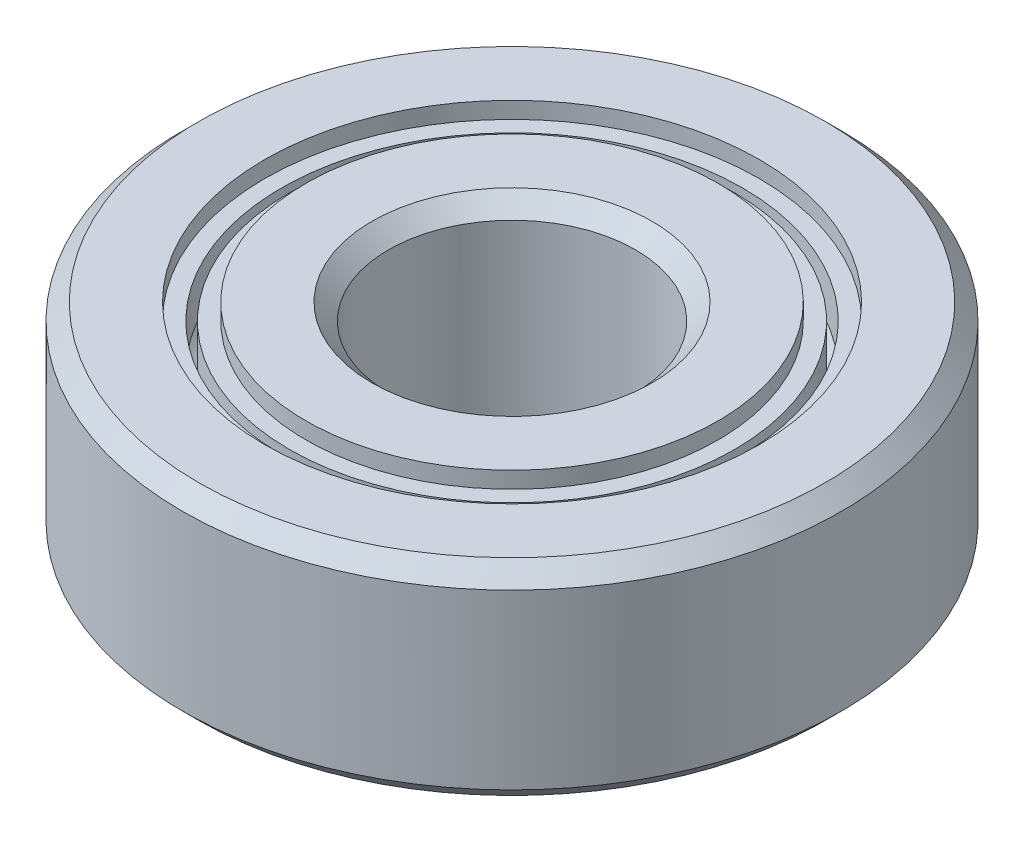
ISO-10303-21;
HEADER;
FILE_DESCRIPTION(('STEP AP214'),'2;1');
FILE_NAME('part.step','',(''),(''),'','','');
FILE_SCHEMA(('AUTOMOTIVE_DESIGN { 1 0 10303 214 1 1 1 1 }'));
ENDSEC;
DATA;
#1=APPLICATION_CONTEXT('core data for automotive mechanical design processes');
#2=APPLICATION_PROTOCOL_DEFINITION('international standard','automotive_design',2000,#1);
#3=PRODUCT_CONTEXT('',#1,'mechanical');
#4=PRODUCT('Part','Part','',(#3));
#5=PRODUCT_RELATED_PRODUCT_CATEGORY('part','',(#4));
#6=PRODUCT_DEFINITION_FORMATION('','',#4);
#7=PRODUCT_DEFINITION_CONTEXT('part definition',#1,'design');
#8=PRODUCT_DEFINITION('design','',#6,#7);
#9=PRODUCT_DEFINITION_SHAPE('','',#8);
#10=(LENGTH_UNIT() NAMED_UNIT(*) SI_UNIT(.MILLI.,.METRE.));
#11=(NAMED_UNIT(*) PLANE_ANGLE_UNIT() SI_UNIT($,.RADIAN.));
#12=(NAMED_UNIT(*) SI_UNIT($,.STERADIAN.) SOLID_ANGLE_UNIT());
#13=UNCERTAINTY_MEASURE_WITH_UNIT(LENGTH_MEASURE(1.E-05),#10,'distance_accuracy_value','');
#14=(GEOMETRIC_REPRESENTATION_CONTEXT(3) GLOBAL_UNCERTAINTY_ASSIGNED_CONTEXT((#13)) GLOBAL_UNIT_ASSIGNED_CONTEXT((#10,
#11,#12)) REPRESENTATION_CONTEXT('',''));
#15=CARTESIAN_POINT('',(0.,0.,0.));
#16=DIRECTION('',(0.,0.,1.));
#17=DIRECTION('',(1.,0.,0.));
#18=AXIS2_PLACEMENT_3D('',#15,#16,#17);
#19=CARTESIAN_POINT('',(2.75,1.,0.));
#20=DIRECTION('',(0.,0.,-1.));
#21=DIRECTION('',(-1.,0.,0.));
#22=AXIS2_PLACEMENT_3D('',#19,#20,#21);
#23=SPHERICAL_SURFACE('',#22,0.5);
#24=CARTESIAN_POINT('',(2.75,1.,-0.5));
#25=VERTEX_POINT('',#24);
#26=VERTEX_LOOP('',#25);
#27=FACE_BOUND('',#26,.T.);
#28=ADVANCED_FACE('P0_F13',(#27),#23,.T.);
#29=CLOSED_SHELL('',(#28));
#30=MANIFOLD_SOLID_BREP('P0_B1',#29);
#31=CARTESIAN_POINT('',(-2.70317602413072,1.,-0.505311173995588));
#32=DIRECTION('',(-0.183749517816578,0.,0.9829730996839));
#33=DIRECTION('',(0.9829730996839,0.,0.183749517816578));
#34=AXIS2_PLACEMENT_3D('',#31,#32,#33);
#35=SPHERICAL_SURFACE('',#34,0.5);
#36=CARTESIAN_POINT('',(-2.79505078303901,1.,-0.013824624153638));
#37=VERTEX_POINT('',#36);
#38=VERTEX_LOOP('',#37);
#39=FACE_BOUND('',#38,.T.);
#40=ADVANCED_FACE('P1_F13',(#39),#35,.T.);
#41=CLOSED_SHELL('',(#40));
#42=MANIFOLD_SOLID_BREP('P1_B1',#41);
#43=CARTESIAN_POINT('',(-2.33809712325643,1.,-1.44768844791275));
#44=DIRECTION('',(-0.526432162877363,0.,0.85021713572961));
#45=DIRECTION('',(0.85021713572961,0.,0.526432162877363));
#46=AXIS2_PLACEMENT_3D('',#43,#44,#45);
#47=SPHERICAL_SURFACE('',#46,0.5);
#48=CARTESIAN_POINT('',(-2.60131320469511,1.,-1.02257988004794));
#49=VERTEX_POINT('',#48);
#50=VERTEX_LOOP('',#49);
#51=FACE_BOUND('',#50,.T.);
#52=ADVANCED_FACE('P2_F13',(#51),#47,.T.);
#53=CLOSED_SHELL('',(#52));
#54=MANIFOLD_SOLID_BREP('P2_B1',#53);
#55=CARTESIAN_POINT('',(-1.65724525004294,1.,-2.19454737502067));
#56=DIRECTION('',(-0.798017227280245,0.,0.60263463637925));
#57=DIRECTION('',(0.60263463637925,0.,0.798017227280245));
#58=AXIS2_PLACEMENT_3D('',#55,#56,#57);
#59=SPHERICAL_SURFACE('',#58,0.5);
#60=CARTESIAN_POINT('',(-2.05625386368306,1.,-1.89323005683105));
#61=VERTEX_POINT('',#60);
#62=VERTEX_LOOP('',#61);
#63=FACE_BOUND('',#62,.T.);
#64=ADVANCED_FACE('P3_F13',(#63),#59,.T.);
#65=CLOSED_SHELL('',(#64));
#66=MANIFOLD_SOLID_BREP('P3_B1',#65);
#67=CARTESIAN_POINT('',(-0.752573222698201,1.,-2.64502051872526));
#68=DIRECTION('',(-0.961825643172822,0.,0.273662990072073));
#69=DIRECTION('',(0.273662990072073,0.,0.961825643172822));
#70=AXIS2_PLACEMENT_3D('',#67,#68,#69);
#71=SPHERICAL_SURFACE('',#70,0.5);
#72=CARTESIAN_POINT('',(-1.23348604428461,1.,-2.50818902368922));
#73=VERTEX_POINT('',#72);
#74=VERTEX_LOOP('',#73);
#75=FACE_BOUND('',#74,.T.);
#76=ADVANCED_FACE('P4_F13',(#75),#71,.T.);
#77=CLOSED_SHELL('',(#76));
#78=MANIFOLD_SOLID_BREP('P4_B1',#77);
#79=CARTESIAN_POINT('',(0.253737988524111,1.,-2.73826898481134));
#80=DIRECTION('',(-0.995734176295034,0.,-0.0922683594633131));
#81=DIRECTION('',(-0.0922683594633131,0.,0.995734176295034));
#82=AXIS2_PLACEMENT_3D('',#79,#80,#81);
#83=SPHERICAL_SURFACE('',#82,0.5);
#84=CARTESIAN_POINT('',(-0.244129099623406,1.,-2.784403164543));
#85=VERTEX_POINT('',#84);
#86=VERTEX_LOOP('',#85);
#87=FACE_BOUND('',#86,.T.);
#88=ADVANCED_FACE('P5_F13',(#87),#83,.T.);
#89=CLOSED_SHELL('',(#88));
#90=MANIFOLD_SOLID_BREP('P5_B1',#89);
#91=CARTESIAN_POINT('',(1.22578047838551,1.,-2.46169905122641));
#92=DIRECTION('',(-0.895163291355057,0.,-0.445738355776549));
#93=DIRECTION('',(-0.445738355776549,0.,0.895163291355057));
#94=AXIS2_PLACEMENT_3D('',#91,#92,#93);
#95=SPHERICAL_SURFACE('',#94,0.5);
#96=CARTESIAN_POINT('',(0.778198832707982,1.,-2.68456822911468));
#97=VERTEX_POINT('',#96);
#98=VERTEX_LOOP('',#97);
#99=FACE_BOUND('',#98,.T.);
#100=ADVANCED_FACE('P6_F13',(#99),#95,.T.);
#101=CLOSED_SHELL('',(#100));
#102=MANIFOLD_SOLID_BREP('P6_B1',#101);
#103=CARTESIAN_POINT('',(2.03227452235683,1.,-1.852663020028));
#104=DIRECTION('',(-0.673695643646548,0.,-0.739008917220668));
#105=DIRECTION('',(-0.739008917220668,0.,0.673695643646548));
#106=AXIS2_PLACEMENT_3D('',#103,#104,#105);
#107=SPHERICAL_SURFACE('',#106,0.5);
#108=CARTESIAN_POINT('',(1.69542670053356,1.,-2.22216747863834));
#109=VERTEX_POINT('',#108);
#110=VERTEX_LOOP('',#109);
#111=FACE_BOUND('',#110,.T.);
#112=ADVANCED_FACE('P7_F13',(#111),#107,.T.);
#113=CLOSED_SHELL('',(#112));
#114=MANIFOLD_SOLID_BREP('P7_B1',#113);
#115=CARTESIAN_POINT('',(2.56429863086199,1.,-0.993414582014636));
#116=DIRECTION('',(-0.361241666187141,0.,-0.93247222940436));
#117=DIRECTION('',(-0.93247222940436,0.,0.361241666187141));
#118=AXIS2_PLACEMENT_3D('',#115,#116,#117);
#119=SPHERICAL_SURFACE('',#118,0.5);
#120=CARTESIAN_POINT('',(2.38367779776842,1.,-1.45965069671682));
#121=VERTEX_POINT('',#120);
#122=VERTEX_LOOP('',#121);
#123=FACE_BOUND('',#122,.T.);
#124=ADVANCED_FACE('P8_F13',(#123),#119,.T.);
#125=CLOSED_SHELL('',(#124));
#126=MANIFOLD_SOLID_BREP('P8_B1',#125);
#127=CARTESIAN_POINT('',(0.,-0.0679996451233789,-3.85));
#128=DIRECTION('',(0.,-1.,0.));
#129=DIRECTION('',(0.,0.,-1.));
#130=AXIS2_PLACEMENT_3D('',#127,#128,#129);
#131=PLANE('',#130);
#132=CARTESIAN_POINT('',(0.,-0.0679996451233792,0.));
#133=DIRECTION('',(0.,-1.,0.));
#134=DIRECTION('',(0.,0.,-1.));
#135=AXIS2_PLACEMENT_3D('',#132,#133,#134);
#136=CIRCLE('',#135,3.85);
#137=CARTESIAN_POINT('',(0.,-0.0679996451233792,-3.85));
#138=VERTEX_POINT('',#137);
#139=EDGE_CURVE('P9_E44',#138,#138,#136,.T.);
#140=ORIENTED_EDGE('',*,*,#139,.F.);
#141=EDGE_LOOP('',(#140));
#142=FACE_BOUND('',#141,.T.);
#143=CARTESIAN_POINT('',(0.,-0.0679996451233786,0.));
#144=DIRECTION('',(0.,-1.,0.));
#145=DIRECTION('',(0.,0.,-1.));
#146=AXIS2_PLACEMENT_3D('',#143,#144,#145);
#147=CIRCLE('',#146,4.125);
#148=CARTESIAN_POINT('',(0.,-0.0679996451233786,-4.125));
#149=VERTEX_POINT('',#148);
#150=EDGE_CURVE('P9_E62',#149,#149,#147,.T.);
#151=ORIENTED_EDGE('',*,*,#150,.T.);
#152=EDGE_LOOP('',(#151));
#153=FACE_BOUND('',#152,.T.);
#154=ADVANCED_FACE('P9_F15',(#142,#153),#131,.T.);
#155=CARTESIAN_POINT('',(0.,2.81799964512338,-3.85));
#156=DIRECTION('',(0.,1.,0.));
#157=DIRECTION('',(1.,0.,0.));
#158=AXIS2_PLACEMENT_3D('',#155,#156,#157);
#159=PLANE('',#158);
#160=CARTESIAN_POINT('',(0.,2.81799964512338,0.));
#161=DIRECTION('',(0.,-1.,0.));
#162=DIRECTION('',(0.,0.,-1.));
#163=AXIS2_PLACEMENT_3D('',#160,#161,#162);
#164=CIRCLE('',#163,3.85);
#165=CARTESIAN_POINT('',(0.,2.81799964512338,-3.85));
#166=VERTEX_POINT('',#165);
#167=EDGE_CURVE('P9_E32',#166,#166,#164,.T.);
#168=ORIENTED_EDGE('',*,*,#167,.T.);
#169=EDGE_LOOP('',(#168));
#170=FACE_BOUND('',#169,.T.);
#171=CARTESIAN_POINT('',(0.,2.81799964512338,0.));
#172=DIRECTION('',(0.,-1.,0.));
#173=DIRECTION('',(0.,0.,-1.));
#174=AXIS2_PLACEMENT_3D('',#171,#172,#173);
#175=CIRCLE('',#174,4.125);
#176=CARTESIAN_POINT('',(0.,2.81799964512338,-4.125));
#177=VERTEX_POINT('',#176);
#178=EDGE_CURVE('P9_E10',#177,#177,#175,.T.);
#179=ORIENTED_EDGE('',*,*,#178,.F.);
#180=EDGE_LOOP('',(#179));
#181=FACE_BOUND('',#180,.T.);
#182=ADVANCED_FACE('P9_F115',(#170,#181),#159,.T.);
#183=CARTESIAN_POINT('',(0.,3.09375,-5.5));
#184=DIRECTION('',(0.,1.,0.));
#185=DIRECTION('',(1.,0.,0.));
#186=AXIS2_PLACEMENT_3D('',#183,#184,#185);
#187=PLANE('',#186);
#188=CARTESIAN_POINT('',(0.,3.09375,0.));
#189=DIRECTION('',(0.,-1.,0.));
#190=DIRECTION('',(0.,0.,-1.));
#191=AXIS2_PLACEMENT_3D('',#188,#189,#190);
#192=CIRCLE('',#191,4.125);
#193=CARTESIAN_POINT('',(0.,3.09375,-4.125));
#194=VERTEX_POINT('',#193);
#195=EDGE_CURVE('P9_E18',#194,#194,#192,.T.);
#196=ORIENTED_EDGE('',*,*,#195,.T.);
#197=EDGE_LOOP('',(#196));
#198=FACE_BOUND('',#197,.T.);
#199=CARTESIAN_POINT('',(0.,3.09375,0.));
#200=DIRECTION('',(0.,1.,0.));
#201=DIRECTION('',(0.,0.,1.));
#202=AXIS2_PLACEMENT_3D('',#199,#200,#201);
#203=CIRCLE('',#202,5.225);
#204=CARTESIAN_POINT('',(0.,3.09375,5.225));
#205=VERTEX_POINT('',#204);
#206=EDGE_CURVE('P9_E92',#205,#205,#203,.T.);
#207=ORIENTED_EDGE('',*,*,#206,.T.);
#208=EDGE_LOOP('',(#207));
#209=FACE_BOUND('',#208,.T.);
#210=ADVANCED_FACE('P9_F99',(#198,#209),#187,.T.);
#211=CARTESIAN_POINT('',(0.,-0.34375,-4.125));
#212=DIRECTION('',(0.,-1.,0.));
#213=DIRECTION('',(0.,0.,-1.));
#214=AXIS2_PLACEMENT_3D('',#211,#212,#213);
#215=PLANE('',#214);
#216=CARTESIAN_POINT('',(0.,-0.34375,0.));
#217=DIRECTION('',(0.,-1.,0.));
#218=DIRECTION('',(0.,0.,-1.));
#219=AXIS2_PLACEMENT_3D('',#216,#217,#218);
#220=CIRCLE('',#219,4.125);
#221=CARTESIAN_POINT('',(0.,-0.34375,-4.125));
#222=VERTEX_POINT('',#221);
#223=EDGE_CURVE('P9_E59',#222,#222,#220,.T.);
#224=ORIENTED_EDGE('',*,*,#223,.F.);
#225=EDGE_LOOP('',(#224));
#226=FACE_BOUND('',#225,.T.);
#227=CARTESIAN_POINT('',(0.,-0.34375,0.));
#228=DIRECTION('',(0.,-1.,0.));
#229=DIRECTION('',(0.,0.,-1.));
#230=AXIS2_PLACEMENT_3D('',#227,#228,#229);
#231=CIRCLE('',#230,5.225);
#232=CARTESIAN_POINT('',(0.,-0.34375,-5.225));
#233=VERTEX_POINT('',#232);
#234=EDGE_CURVE('P9_E79',#233,#233,#231,.T.);
#235=ORIENTED_EDGE('',*,*,#234,.T.);
#236=EDGE_LOOP('',(#235));
#237=FACE_BOUND('',#236,.T.);
#238=ADVANCED_FACE('P9_F123',(#226,#237),#215,.T.);
#239=CARTESIAN_POINT('',(0.,0.,0.));
#240=DIRECTION('',(0.,-1.,0.));
#241=DIRECTION('',(0.,0.,-1.));
#242=AXIS2_PLACEMENT_3D('',#239,#240,#241);
#243=CYLINDRICAL_SURFACE('',#242,5.5);
#244=CARTESIAN_POINT('',(0.,-0.0687499999999976,0.));
#245=DIRECTION('',(0.,1.,0.));
#246=DIRECTION('',(0.,0.,-1.));
#247=AXIS2_PLACEMENT_3D('',#244,#245,#246);
#248=CIRCLE('',#247,5.5);
#249=CARTESIAN_POINT('',(0.,-0.0687499999999976,-5.5));
#250=VERTEX_POINT('',#249);
#251=EDGE_CURVE('P9_E72',#250,#250,#248,.T.);
#252=ORIENTED_EDGE('',*,*,#251,.T.);
#253=EDGE_LOOP('',(#252));
#254=FACE_BOUND('',#253,.T.);
#255=CARTESIAN_POINT('',(0.,2.81875,0.));
#256=DIRECTION('',(0.,-1.,0.));
#257=DIRECTION('',(0.,0.,1.));
#258=AXIS2_PLACEMENT_3D('',#255,#256,#257);
#259=CIRCLE('',#258,5.5);
#260=CARTESIAN_POINT('',(0.,2.81875,5.5));
#261=VERTEX_POINT('',#260);
#262=EDGE_CURVE('P9_E87',#261,#261,#259,.T.);
#263=ORIENTED_EDGE('',*,*,#262,.T.);
#264=EDGE_LOOP('',(#263));
#265=FACE_BOUND('',#264,.T.);
#266=ADVANCED_FACE('P9_F130',(#254,#265),#243,.T.);
#267=CARTESIAN_POINT('',(0.,0.,0.));
#268=DIRECTION('',(0.,-1.,0.));
#269=DIRECTION('',(0.,0.,-1.));
#270=AXIS2_PLACEMENT_3D('',#267,#268,#269);
#271=CYLINDRICAL_SURFACE('',#270,4.125);
#272=ORIENTED_EDGE('',*,*,#178,.T.);
#273=EDGE_LOOP('',(#272));
#274=FACE_BOUND('',#273,.T.);
#275=ORIENTED_EDGE('',*,*,#195,.F.);
#276=EDGE_LOOP('',(#275));
#277=FACE_BOUND('',#276,.T.);
#278=ADVANCED_FACE('P9_F134',(#274,#277),#271,.F.);
#279=CARTESIAN_POINT('',(0.,0.,0.));
#280=DIRECTION('',(0.,-1.,0.));
#281=DIRECTION('',(0.,0.,-1.));
#282=AXIS2_PLACEMENT_3D('',#279,#280,#281);
#283=CYLINDRICAL_SURFACE('',#282,3.85);
#284=CARTESIAN_POINT('',(0.,2.09359373301261,0.));
#285=DIRECTION('',(0.,-1.,0.));
#286=DIRECTION('',(0.,0.,-1.));
#287=AXIS2_PLACEMENT_3D('',#284,#285,#286);
#288=CIRCLE('',#287,3.85);
#289=CARTESIAN_POINT('',(0.,2.09359373301261,-3.85));
#290=VERTEX_POINT('',#289);
#291=EDGE_CURVE('P9_E34',#290,#290,#288,.T.);
#292=ORIENTED_EDGE('',*,*,#291,.T.);
#293=EDGE_LOOP('',(#292));
#294=FACE_BOUND('',#293,.T.);
#295=ORIENTED_EDGE('',*,*,#167,.F.);
#296=EDGE_LOOP('',(#295));
#297=FACE_BOUND('',#296,.T.);
#298=ADVANCED_FACE('P9_F135',(#294,#297),#283,.F.);
#299=CARTESIAN_POINT('',(0.,1.375,0.));
#300=DIRECTION('',(0.,-1.,0.));
#301=DIRECTION('',(0.,0.,-1.));
#302=AXIS2_PLACEMENT_3D('',#299,#300,#301);
#303=TOROIDAL_SURFACE('',#302,3.78125,0.721875);
#304=CARTESIAN_POINT('',(0.,0.656406266987388,0.));
#305=DIRECTION('',(0.,-1.,0.));
#306=DIRECTION('',(0.,0.,-1.));
#307=AXIS2_PLACEMENT_3D('',#304,#305,#306);
#308=CIRCLE('',#307,3.85);
#309=CARTESIAN_POINT('',(0.,0.656406266987388,-3.85));
#310=VERTEX_POINT('',#309);
#311=EDGE_CURVE('P9_E51',#310,#310,#308,.T.);
#312=ORIENTED_EDGE('',*,*,#311,.T.);
#313=EDGE_LOOP('',(#312));
#314=FACE_BOUND('',#313,.T.);
#315=ORIENTED_EDGE('',*,*,#291,.F.);
#316=EDGE_LOOP('',(#315));
#317=FACE_BOUND('',#316,.T.);
#318=ADVANCED_FACE('P9_F138',(#314,#317),#303,.F.);
#319=CARTESIAN_POINT('',(0.,0.,0.));
#320=DIRECTION('',(0.,-1.,0.));
#321=DIRECTION('',(0.,0.,-1.));
#322=AXIS2_PLACEMENT_3D('',#319,#320,#321);
#323=CYLINDRICAL_SURFACE('',#322,3.85);
#324=ORIENTED_EDGE('',*,*,#139,.T.);
#325=EDGE_LOOP('',(#324));
#326=FACE_BOUND('',#325,.T.);
#327=ORIENTED_EDGE('',*,*,#311,.F.);
#328=EDGE_LOOP('',(#327));
#329=FACE_BOUND('',#328,.T.);
#330=ADVANCED_FACE('P9_F141',(#326,#329),#323,.F.);
#331=CARTESIAN_POINT('',(0.,0.,0.));
#332=DIRECTION('',(0.,-1.,0.));
#333=DIRECTION('',(0.,0.,-1.));
#334=AXIS2_PLACEMENT_3D('',#331,#332,#333);
#335=CYLINDRICAL_SURFACE('',#334,4.125);
#336=ORIENTED_EDGE('',*,*,#223,.T.);
#337=EDGE_LOOP('',(#336));
#338=FACE_BOUND('',#337,.T.);
#339=ORIENTED_EDGE('',*,*,#150,.F.);
#340=EDGE_LOOP('',(#339));
#341=FACE_BOUND('',#340,.T.);
#342=ADVANCED_FACE('P9_F110',(#338,#341),#335,.F.);
#343=CARTESIAN_POINT('',(0.,-0.34375,0.));
#344=DIRECTION('',(0.,1.,0.));
#345=DIRECTION('',(0.,0.,1.));
#346=AXIS2_PLACEMENT_3D('',#343,#344,#345);
#347=CONICAL_SURFACE('',#346,5.225,0.785398163397448);
#348=ORIENTED_EDGE('',*,*,#251,.F.);
#349=EDGE_LOOP('',(#348));
#350=FACE_BOUND('',#349,.T.);
#351=ORIENTED_EDGE('',*,*,#234,.F.);
#352=EDGE_LOOP('',(#351));
#353=FACE_BOUND('',#352,.T.);
#354=ADVANCED_FACE('P9_F103',(#350,#353),#347,.T.);
#355=CARTESIAN_POINT('',(0.,2.81875,0.));
#356=DIRECTION('',(0.,-1.,0.));
#357=DIRECTION('',(0.,0.,-1.));
#358=AXIS2_PLACEMENT_3D('',#355,#356,#357);
#359=CONICAL_SURFACE('',#358,5.5,0.785398163397448);
#360=ORIENTED_EDGE('',*,*,#262,.F.);
#361=EDGE_LOOP('',(#360));
#362=FACE_BOUND('',#361,.T.);
#363=ORIENTED_EDGE('',*,*,#206,.F.);
#364=EDGE_LOOP('',(#363));
#365=FACE_BOUND('',#364,.T.);
#366=ADVANCED_FACE('P9_F101',(#362,#365),#359,.T.);
#367=CLOSED_SHELL('',(#154,#182,#210,#238,#266,#278,#298,#318,#330,#342,#354,#366));
#368=MANIFOLD_SOLID_BREP('P9_B1',#367);
#369=CARTESIAN_POINT('',(0.,3.09375,-3.4375));
#370=DIRECTION('',(0.,1.,0.));
#371=DIRECTION('',(1.,0.,0.));
#372=AXIS2_PLACEMENT_3D('',#369,#370,#371);
#373=PLANE('',#372);
#374=CARTESIAN_POINT('',(0.,3.09375,0.));
#375=DIRECTION('',(0.,-1.,0.));
#376=DIRECTION('',(0.,0.,1.));
#377=AXIS2_PLACEMENT_3D('',#374,#375,#376);
#378=CIRCLE('',#377,2.3375);
#379=CARTESIAN_POINT('',(0.,3.09375,2.3375));
#380=VERTEX_POINT('',#379);
#381=EDGE_CURVE('P10_E62',#380,#380,#378,.T.);
#382=ORIENTED_EDGE('',*,*,#381,.T.);
#383=EDGE_LOOP('',(#382));
#384=FACE_BOUND('',#383,.T.);
#385=CARTESIAN_POINT('',(0.,3.09375,0.));
#386=DIRECTION('',(0.,-1.,0.));
#387=DIRECTION('',(0.,0.,-1.));
#388=AXIS2_PLACEMENT_3D('',#385,#386,#387);
#389=CIRCLE('',#388,3.4375);
#390=CARTESIAN_POINT('',(0.,3.09375,-3.4375));
#391=VERTEX_POINT('',#390);
#392=EDGE_CURVE('P10_E52',#391,#391,#389,.T.);
#393=ORIENTED_EDGE('',*,*,#392,.F.);
#394=EDGE_LOOP('',(#393));
#395=FACE_BOUND('',#394,.T.);
#396=ADVANCED_FACE('P10_F15',(#384,#395),#373,.T.);
#397=CARTESIAN_POINT('',(0.,2.81799964512338,-3.4375));
#398=DIRECTION('',(0.,1.,0.));
#399=DIRECTION('',(1.,0.,0.));
#400=AXIS2_PLACEMENT_3D('',#397,#398,#399);
#401=PLANE('',#400);
#402=CARTESIAN_POINT('',(0.,2.81799964512338,0.));
#403=DIRECTION('',(0.,-1.,0.));
#404=DIRECTION('',(0.,0.,-1.));
#405=AXIS2_PLACEMENT_3D('',#402,#403,#404);
#406=CIRCLE('',#405,3.4375);
#407=CARTESIAN_POINT('',(0.,2.81799964512338,-3.4375));
#408=VERTEX_POINT('',#407);
#409=EDGE_CURVE('P10_E48',#408,#408,#406,.T.);
#410=ORIENTED_EDGE('',*,*,#409,.T.);
#411=EDGE_LOOP('',(#410));
#412=FACE_BOUND('',#411,.T.);
#413=CARTESIAN_POINT('',(0.,2.81799964512338,0.));
#414=DIRECTION('',(0.,-1.,0.));
#415=DIRECTION('',(0.,0.,-1.));
#416=AXIS2_PLACEMENT_3D('',#413,#414,#415);
#417=CIRCLE('',#416,3.7125);
#418=CARTESIAN_POINT('',(0.,2.81799964512338,-3.7125));
#419=VERTEX_POINT('',#418);
#420=EDGE_CURVE('P10_E44',#419,#419,#417,.T.);
#421=ORIENTED_EDGE('',*,*,#420,.F.);
#422=EDGE_LOOP('',(#421));
#423=FACE_BOUND('',#422,.T.);
#424=ADVANCED_FACE('P10_F82',(#412,#423),#401,.T.);
#425=CARTESIAN_POINT('',(0.,-0.0679996451233792,-3.4375));
#426=DIRECTION('',(0.,-1.,0.));
#427=DIRECTION('',(0.,0.,-1.));
#428=AXIS2_PLACEMENT_3D('',#425,#426,#427);
#429=PLANE('',#428);
#430=CARTESIAN_POINT('',(0.,-0.0679996451233792,0.));
#431=DIRECTION('',(0.,-1.,0.));
#432=DIRECTION('',(0.,0.,-1.));
#433=AXIS2_PLACEMENT_3D('',#430,#431,#432);
#434=CIRCLE('',#433,3.4375);
#435=CARTESIAN_POINT('',(0.,-0.0679996451233792,-3.4375));
#436=VERTEX_POINT('',#435);
#437=EDGE_CURVE('P10_E22',#436,#436,#434,.T.);
#438=ORIENTED_EDGE('',*,*,#437,.F.);
#439=EDGE_LOOP('',(#438));
#440=FACE_BOUND('',#439,.T.);
#441=CARTESIAN_POINT('',(0.,-0.0679996451233792,0.));
#442=DIRECTION('',(0.,-1.,0.));
#443=DIRECTION('',(0.,0.,-1.));
#444=AXIS2_PLACEMENT_3D('',#441,#442,#443);
#445=CIRCLE('',#444,3.7125);
#446=CARTESIAN_POINT('',(0.,-0.0679996451233792,-3.7125));
#447=VERTEX_POINT('',#446);
#448=EDGE_CURVE('P10_E31',#447,#447,#445,.T.);
#449=ORIENTED_EDGE('',*,*,#448,.T.);
#450=EDGE_LOOP('',(#449));
#451=FACE_BOUND('',#450,.T.);
#452=ADVANCED_FACE('P10_F88',(#440,#451),#429,.T.);
#453=CARTESIAN_POINT('',(0.,-0.34375,-2.0625));
#454=DIRECTION('',(0.,-1.,0.));
#455=DIRECTION('',(0.,0.,-1.));
#456=AXIS2_PLACEMENT_3D('',#453,#454,#455);
#457=PLANE('',#456);
#458=CARTESIAN_POINT('',(0.,-0.34375,0.));
#459=DIRECTION('',(0.,1.,0.));
#460=DIRECTION('',(0.,0.,-1.));
#461=AXIS2_PLACEMENT_3D('',#458,#459,#460);
#462=CIRCLE('',#461,2.3375);
#463=CARTESIAN_POINT('',(0.,-0.34375,-2.3375));
#464=VERTEX_POINT('',#463);
#465=EDGE_CURVE('P10_E53',#464,#464,#462,.T.);
#466=ORIENTED_EDGE('',*,*,#465,.T.);
#467=EDGE_LOOP('',(#466));
#468=FACE_BOUND('',#467,.T.);
#469=CARTESIAN_POINT('',(0.,-0.34375,0.));
#470=DIRECTION('',(0.,-1.,0.));
#471=DIRECTION('',(0.,0.,-1.));
#472=AXIS2_PLACEMENT_3D('',#469,#470,#471);
#473=CIRCLE('',#472,3.4375);
#474=CARTESIAN_POINT('',(0.,-0.34375,-3.4375));
#475=VERTEX_POINT('',#474);
#476=EDGE_CURVE('P10_E10',#475,#475,#473,.T.);
#477=ORIENTED_EDGE('',*,*,#476,.T.);
#478=EDGE_LOOP('',(#477));
#479=FACE_BOUND('',#478,.T.);
#480=ADVANCED_FACE('P10_F102',(#468,#479),#457,.T.);
#481=CARTESIAN_POINT('',(0.,0.,0.));
#482=DIRECTION('',(0.,-1.,0.));
#483=DIRECTION('',(0.,0.,-1.));
#484=AXIS2_PLACEMENT_3D('',#481,#482,#483);
#485=CYLINDRICAL_SURFACE('',#484,2.0625);
#486=CARTESIAN_POINT('',(0.,-0.0687499999999988,0.));
#487=DIRECTION('',(0.,-1.,0.));
#488=DIRECTION('',(0.,0.,-1.));
#489=AXIS2_PLACEMENT_3D('',#486,#487,#488);
#490=CIRCLE('',#489,2.0625);
#491=CARTESIAN_POINT('',(0.,-0.0687499999999988,-2.0625));
#492=VERTEX_POINT('',#491);
#493=EDGE_CURVE('P10_E58',#492,#492,#490,.T.);
#494=ORIENTED_EDGE('',*,*,#493,.T.);
#495=EDGE_LOOP('',(#494));
#496=FACE_BOUND('',#495,.T.);
#497=CARTESIAN_POINT('',(0.,2.81875,0.));
#498=DIRECTION('',(0.,1.,0.));
#499=DIRECTION('',(0.,0.,1.));
#500=AXIS2_PLACEMENT_3D('',#497,#498,#499);
#501=CIRCLE('',#500,2.0625);
#502=CARTESIAN_POINT('',(0.,2.81875,2.0625));
#503=VERTEX_POINT('',#502);
#504=EDGE_CURVE('P10_E57',#503,#503,#501,.T.);
#505=ORIENTED_EDGE('',*,*,#504,.T.);
#506=EDGE_LOOP('',(#505));
#507=FACE_BOUND('',#506,.T.);
#508=ADVANCED_FACE('P10_F99',(#496,#507),#485,.F.);
#509=CARTESIAN_POINT('',(0.,0.,0.));
#510=DIRECTION('',(0.,-1.,0.));
#511=DIRECTION('',(0.,0.,-1.));
#512=AXIS2_PLACEMENT_3D('',#509,#510,#511);
#513=CYLINDRICAL_SURFACE('',#512,3.4375);
#514=ORIENTED_EDGE('',*,*,#476,.F.);
#515=EDGE_LOOP('',(#514));
#516=FACE_BOUND('',#515,.T.);
#517=ORIENTED_EDGE('',*,*,#437,.T.);
#518=EDGE_LOOP('',(#517));
#519=FACE_BOUND('',#518,.T.);
#520=ADVANCED_FACE('P10_F101',(#516,#519),#513,.T.);
#521=CARTESIAN_POINT('',(0.,0.,0.));
#522=DIRECTION('',(0.,-1.,0.));
#523=DIRECTION('',(0.,0.,-1.));
#524=AXIS2_PLACEMENT_3D('',#521,#522,#523);
#525=CYLINDRICAL_SURFACE('',#524,3.7125);
#526=ORIENTED_EDGE('',*,*,#448,.F.);
#527=EDGE_LOOP('',(#526));
#528=FACE_BOUND('',#527,.T.);
#529=CARTESIAN_POINT('',(0.,0.656406266987388,0.));
#530=DIRECTION('',(0.,-1.,0.));
#531=DIRECTION('',(0.,0.,-1.));
#532=AXIS2_PLACEMENT_3D('',#529,#530,#531);
#533=CIRCLE('',#532,3.7125);
#534=CARTESIAN_POINT('',(0.,0.656406266987388,-3.7125));
#535=VERTEX_POINT('',#534);
#536=EDGE_CURVE('P10_E66',#535,#535,#533,.T.);
#537=ORIENTED_EDGE('',*,*,#536,.T.);
#538=EDGE_LOOP('',(#537));
#539=FACE_BOUND('',#538,.T.);
#540=ADVANCED_FACE('P10_F109',(#528,#539),#525,.T.);
#541=CARTESIAN_POINT('',(0.,0.,0.));
#542=DIRECTION('',(0.,-1.,0.));
#543=DIRECTION('',(0.,0.,-1.));
#544=AXIS2_PLACEMENT_3D('',#541,#542,#543);
#545=CYLINDRICAL_SURFACE('',#544,3.7125);
#546=CARTESIAN_POINT('',(0.,2.09359373301261,0.));
#547=DIRECTION('',(0.,-1.,0.));
#548=DIRECTION('',(0.,0.,-1.));
#549=AXIS2_PLACEMENT_3D('',#546,#547,#548);
#550=CIRCLE('',#549,3.7125);
#551=CARTESIAN_POINT('',(0.,2.09359373301261,-3.7125));
#552=VERTEX_POINT('',#551);
#553=EDGE_CURVE('P10_E38',#552,#552,#550,.T.);
#554=ORIENTED_EDGE('',*,*,#553,.F.);
#555=EDGE_LOOP('',(#554));
#556=FACE_BOUND('',#555,.T.);
#557=ORIENTED_EDGE('',*,*,#420,.T.);
#558=EDGE_LOOP('',(#557));
#559=FACE_BOUND('',#558,.T.);
#560=ADVANCED_FACE('P10_F119',(#556,#559),#545,.T.);
#561=CARTESIAN_POINT('',(0.,0.,0.));
#562=DIRECTION('',(0.,-1.,0.));
#563=DIRECTION('',(0.,0.,-1.));
#564=AXIS2_PLACEMENT_3D('',#561,#562,#563);
#565=CYLINDRICAL_SURFACE('',#564,3.4375);
#566=ORIENTED_EDGE('',*,*,#409,.F.);
#567=EDGE_LOOP('',(#566));
#568=FACE_BOUND('',#567,.T.);
#569=ORIENTED_EDGE('',*,*,#392,.T.);
#570=EDGE_LOOP('',(#569));
#571=FACE_BOUND('',#570,.T.);
#572=ADVANCED_FACE('P10_F79',(#568,#571),#565,.T.);
#573=CARTESIAN_POINT('',(0.,3.09375,0.));
#574=DIRECTION('',(0.,1.,0.));
#575=DIRECTION('',(0.,0.,1.));
#576=AXIS2_PLACEMENT_3D('',#573,#574,#575);
#577=CONICAL_SURFACE('',#576,2.3375,0.785398163397448);
#578=ORIENTED_EDGE('',*,*,#381,.F.);
#579=EDGE_LOOP('',(#578));
#580=FACE_BOUND('',#579,.T.);
#581=ORIENTED_EDGE('',*,*,#504,.F.);
#582=EDGE_LOOP('',(#581));
#583=FACE_BOUND('',#582,.T.);
#584=ADVANCED_FACE('P10_F92',(#580,#583),#577,.F.);
#585=CARTESIAN_POINT('',(0.,-0.0687499999999988,0.));
#586=DIRECTION('',(0.,-1.,0.));
#587=DIRECTION('',(0.,0.,-1.));
#588=AXIS2_PLACEMENT_3D('',#585,#586,#587);
#589=CONICAL_SURFACE('',#588,2.0625,0.78539816339745);
#590=ORIENTED_EDGE('',*,*,#465,.F.);
#591=EDGE_LOOP('',(#590));
#592=FACE_BOUND('',#591,.T.);
#593=ORIENTED_EDGE('',*,*,#493,.F.);
#594=EDGE_LOOP('',(#593));
#595=FACE_BOUND('',#594,.T.);
#596=ADVANCED_FACE('P10_F95',(#592,#595),#589,.F.);
#597=CARTESIAN_POINT('',(0.,1.375,0.));
#598=DIRECTION('',(0.,-1.,0.));
#599=DIRECTION('',(0.,0.,-1.));
#600=AXIS2_PLACEMENT_3D('',#597,#598,#599);
#601=TOROIDAL_SURFACE('',#600,3.78125,0.721875);
#602=ORIENTED_EDGE('',*,*,#536,.F.);
#603=EDGE_LOOP('',(#602));
#604=FACE_BOUND('',#603,.T.);
#605=ORIENTED_EDGE('',*,*,#553,.T.);
#606=EDGE_LOOP('',(#605));
#607=FACE_BOUND('',#606,.T.);
#608=ADVANCED_FACE('P10_F116',(#604,#607),#601,.F.);
#609=CLOSED_SHELL('',(#396,#424,#452,#480,#508,#520,#540,#560,#572,#584,#596,#608));
#610=MANIFOLD_SOLID_BREP('P10_B1',#609);
#611=CARTESIAN_POINT('',(2.56429863086198,1.,0.993414582014672));
#612=DIRECTION('',(0.361241666187154,0.,-0.932472229404356));
#613=DIRECTION('',(-0.932472229404356,0.,-0.361241666187154));
#614=AXIS2_PLACEMENT_3D('',#611,#612,#613);
#615=SPHERICAL_SURFACE('',#614,0.5);
#616=CARTESIAN_POINT('',(2.74491946395555,1.,0.527178467312494));
#617=VERTEX_POINT('',#616);
#618=VERTEX_LOOP('',#617);
#619=FACE_BOUND('',#618,.T.);
#620=ADVANCED_FACE('P11_F13',(#619),#615,.T.);
#621=CLOSED_SHELL('',(#620));
#622=MANIFOLD_SOLID_BREP('P11_B1',#621);
#623=CARTESIAN_POINT('',(2.03227452235681,1.,1.85266302002803));
#624=DIRECTION('',(0.673695643646559,0.,-0.739008917220658));
#625=DIRECTION('',(-0.739008917220658,0.,-0.673695643646559));
#626=AXIS2_PLACEMENT_3D('',#623,#624,#625);
#627=SPHERICAL_SURFACE('',#626,0.5);
#628=CARTESIAN_POINT('',(2.36912234418009,1.,1.48315856141771));
#629=VERTEX_POINT('',#628);
#630=VERTEX_LOOP('',#629);
#631=FACE_BOUND('',#630,.T.);
#632=ADVANCED_FACE('P12_F13',(#631),#627,.T.);
#633=CLOSED_SHELL('',(#632));
#634=MANIFOLD_SOLID_BREP('P12_B1',#633);
#635=CARTESIAN_POINT('',(1.22578047838547,1.,2.46169905122643));
#636=DIRECTION('',(0.895163291355064,0.,-0.445738355776536));
#637=DIRECTION('',(-0.445738355776536,0.,-0.895163291355064));
#638=AXIS2_PLACEMENT_3D('',#635,#636,#637);
#639=SPHERICAL_SURFACE('',#638,0.5);
#640=CARTESIAN_POINT('',(1.67336212406301,1.,2.23882987333816));
#641=VERTEX_POINT('',#640);
#642=VERTEX_LOOP('',#641);
#643=FACE_BOUND('',#642,.T.);
#644=ADVANCED_FACE('P13_F13',(#643),#639,.T.);
#645=CLOSED_SHELL('',(#644));
#646=MANIFOLD_SOLID_BREP('P13_B1',#645);
#647=CARTESIAN_POINT('',(0.253737988524071,1.,2.73826898481134));
#648=DIRECTION('',(0.995734176295035,0.,-0.0922683594632987));
#649=DIRECTION('',(-0.0922683594632987,0.,-0.995734176295035));
#650=AXIS2_PLACEMENT_3D('',#647,#648,#649);
#651=SPHERICAL_SURFACE('',#650,0.5);
#652=CARTESIAN_POINT('',(0.751605076671589,1.,2.6921348050797));
#653=VERTEX_POINT('',#652);
#654=VERTEX_LOOP('',#653);
#655=FACE_BOUND('',#654,.T.);
#656=ADVANCED_FACE('P14_F13',(#655),#651,.T.);
#657=CLOSED_SHELL('',(#656));
#658=MANIFOLD_SOLID_BREP('P14_B1',#657);
#659=CARTESIAN_POINT('',(-0.752573222698239,1.,2.64502051872525));
#660=DIRECTION('',(0.961825643172818,0.,0.273662990072087));
#661=DIRECTION('',(0.273662990072087,0.,-0.961825643172818));
#662=AXIS2_PLACEMENT_3D('',#659,#660,#661);
#663=SPHERICAL_SURFACE('',#662,0.5);
#664=CARTESIAN_POINT('',(-0.27166040111183,1.,2.78185201376129));
#665=VERTEX_POINT('',#664);
#666=VERTEX_LOOP('',#665);
#667=FACE_BOUND('',#666,.T.);
#668=ADVANCED_FACE('P15_F13',(#667),#663,.T.);
#669=CLOSED_SHELL('',(#668));
#670=MANIFOLD_SOLID_BREP('P15_B1',#669);
#671=CARTESIAN_POINT('',(-1.65724525004296,1.,2.19454737502065));
#672=DIRECTION('',(0.798017227280237,0.,0.60263463637926));
#673=DIRECTION('',(0.60263463637926,0.,-0.798017227280237));
#674=AXIS2_PLACEMENT_3D('',#671,#672,#673);
#675=SPHERICAL_SURFACE('',#674,0.5);
#676=CARTESIAN_POINT('',(-1.25823663640285,1.,2.49586469321028));
#677=VERTEX_POINT('',#676);
#678=VERTEX_LOOP('',#677);
#679=FACE_BOUND('',#678,.T.);
#680=ADVANCED_FACE('P16_F13',(#679),#675,.T.);
#681=CLOSED_SHELL('',(#680));
#682=MANIFOLD_SOLID_BREP('P16_B1',#681);
#683=CARTESIAN_POINT('',(-2.33809712325645,1.,1.44768844791271));
#684=DIRECTION('',(0.526432162877351,0.,0.850217135729617));
#685=DIRECTION('',(0.850217135729617,0.,-0.526432162877351));
#686=AXIS2_PLACEMENT_3D('',#683,#684,#685);
#687=SPHERICAL_SURFACE('',#686,0.5);
#688=CARTESIAN_POINT('',(-2.07488104181777,1.,1.87279701577752));
#689=VERTEX_POINT('',#688);
#690=VERTEX_LOOP('',#689);
#691=FACE_BOUND('',#690,.T.);
#692=ADVANCED_FACE('P17_F13',(#691),#687,.T.);
#693=CLOSED_SHELL('',(#692));
#694=MANIFOLD_SOLID_BREP('P17_B1',#693);
#695=CARTESIAN_POINT('',(-2.70317602413074,1.,0.505311173995551));
#696=DIRECTION('',(0.183749517816564,0.,0.982973099683903));
#697=DIRECTION('',(0.982973099683903,0.,-0.183749517816564));
#698=AXIS2_PLACEMENT_3D('',#695,#696,#697);
#699=SPHERICAL_SURFACE('',#698,0.5);
#700=CARTESIAN_POINT('',(-2.61130126522245,1.,0.996797723837503));
#701=VERTEX_POINT('',#700);
#702=VERTEX_LOOP('',#701);
#703=FACE_BOUND('',#702,.T.);
#704=ADVANCED_FACE('P18_F13',(#703),#699,.T.);
#705=CLOSED_SHELL('',(#704));
#706=MANIFOLD_SOLID_BREP('P18_B1',#705);
#707=ADVANCED_BREP_SHAPE_REPRESENTATION('',(#18,#30,#42,#54,#66,#78,#90,#102,#114,#126,#368,
#610,#622,#634,#646,#658,#670,#682,#694,#706),#14);
#708=SHAPE_DEFINITION_REPRESENTATION(#9,#707);
ENDSEC;
END-ISO-10303-21;
